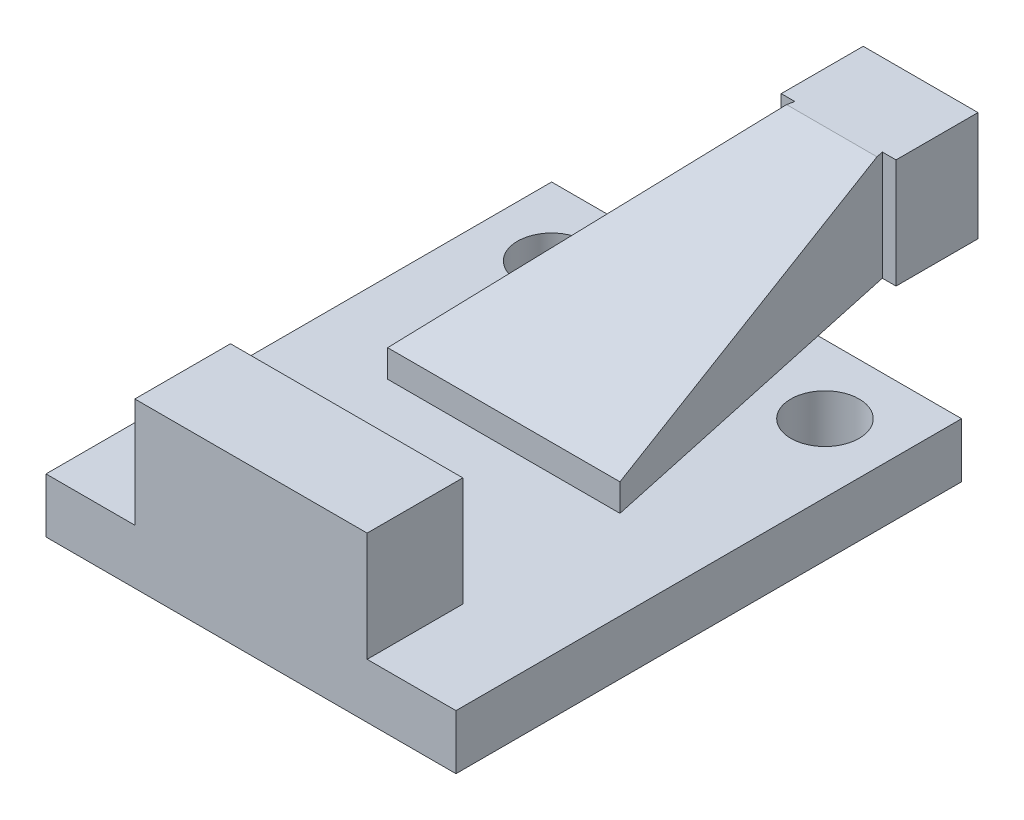
ISO-10303-21;
HEADER;
FILE_DESCRIPTION(('STEP AP214'),'2;1');
FILE_NAME('part.step','',(''),(''),'','','');
FILE_SCHEMA(('AUTOMOTIVE_DESIGN { 1 0 10303 214 1 1 1 1 }'));
ENDSEC;
DATA;
#1=APPLICATION_CONTEXT('core data for automotive mechanical design processes');
#2=APPLICATION_PROTOCOL_DEFINITION('international standard','automotive_design',2000,#1);
#3=PRODUCT_CONTEXT('',#1,'mechanical');
#4=PRODUCT('Part','Part','',(#3));
#5=PRODUCT_RELATED_PRODUCT_CATEGORY('part','',(#4));
#6=PRODUCT_DEFINITION_FORMATION('','',#4);
#7=PRODUCT_DEFINITION_CONTEXT('part definition',#1,'design');
#8=PRODUCT_DEFINITION('design','',#6,#7);
#9=PRODUCT_DEFINITION_SHAPE('','',#8);
#10=(LENGTH_UNIT() NAMED_UNIT(*) SI_UNIT(.MILLI.,.METRE.));
#11=(NAMED_UNIT(*) PLANE_ANGLE_UNIT() SI_UNIT($,.RADIAN.));
#12=(NAMED_UNIT(*) SI_UNIT($,.STERADIAN.) SOLID_ANGLE_UNIT());
#13=UNCERTAINTY_MEASURE_WITH_UNIT(LENGTH_MEASURE(1.E-05),#10,'distance_accuracy_value','');
#14=(GEOMETRIC_REPRESENTATION_CONTEXT(3) GLOBAL_UNCERTAINTY_ASSIGNED_CONTEXT((#13)) GLOBAL_UNIT_ASSIGNED_CONTEXT((#10,
#11,#12)) REPRESENTATION_CONTEXT('',''));
#15=CARTESIAN_POINT('',(0.,0.,0.));
#16=DIRECTION('',(0.,0.,1.));
#17=DIRECTION('',(1.,0.,0.));
#18=AXIS2_PLACEMENT_3D('',#15,#16,#17);
#19=CARTESIAN_POINT('',(0.,2.,0.));
#20=DIRECTION('',(0.,1.,0.));
#21=DIRECTION('',(0.,0.,1.));
#22=AXIS2_PLACEMENT_3D('',#19,#20,#21);
#23=PLANE('',#22);
#24=CARTESIAN_POINT('',(2.5,2.,-16.));
#25=DIRECTION('',(0.,1.,0.));
#26=DIRECTION('',(0.,0.,1.));
#27=AXIS2_PLACEMENT_3D('',#24,#25,#26);
#28=CIRCLE('',#27,1.25);
#29=CARTESIAN_POINT('',(2.5,2.,-14.75));
#30=VERTEX_POINT('',#29);
#31=EDGE_CURVE('E294',#30,#30,#28,.T.);
#32=ORIENTED_EDGE('',*,*,#31,.F.);
#33=EDGE_LOOP('',(#32));
#34=FACE_BOUND('',#33,.T.);
#35=CARTESIAN_POINT('',(12.5,2.,-16.));
#36=DIRECTION('',(0.,1.,0.));
#37=DIRECTION('',(0.,0.,-1.));
#38=AXIS2_PLACEMENT_3D('',#35,#36,#37);
#39=CIRCLE('',#38,1.25);
#40=CARTESIAN_POINT('',(12.5,2.,-17.25));
#41=VERTEX_POINT('',#40);
#42=EDGE_CURVE('E286',#41,#41,#39,.T.);
#43=ORIENTED_EDGE('',*,*,#42,.F.);
#44=EDGE_LOOP('',(#43));
#45=FACE_BOUND('',#44,.T.);
#46=DIRECTION('',(-1.,0.,0.));
#47=VECTOR('',#46,1.);
#48=CARTESIAN_POINT('',(0.,2.,-18.5));
#49=LINE('',#48,#47);
#50=CARTESIAN_POINT('',(15.,2.,-18.5));
#51=VERTEX_POINT('',#50);
#52=CARTESIAN_POINT('',(9.74897959183673,2.,-18.5));
#53=VERTEX_POINT('',#52);
#54=EDGE_CURVE('E315',#51,#53,#49,.T.);
#55=ORIENTED_EDGE('',*,*,#54,.T.);
#56=DIRECTION('',(-0.211435796323971,0.,-0.977391888667411));
#57=VECTOR('',#56,1.);
#58=CARTESIAN_POINT('',(11.75,2.,-9.25));
#59=LINE('',#58,#57);
#60=CARTESIAN_POINT('',(11.75,2.,-9.25));
#61=VERTEX_POINT('',#60);
#62=EDGE_CURVE('E219',#61,#53,#59,.T.);
#63=ORIENTED_EDGE('',*,*,#62,.F.);
#64=DIRECTION('',(1.,0.,0.));
#65=VECTOR('',#64,1.);
#66=CARTESIAN_POINT('',(3.25,2.,-9.25));
#67=LINE('',#66,#65);
#68=CARTESIAN_POINT('',(3.25,2.,-9.25));
#69=VERTEX_POINT('',#68);
#70=EDGE_CURVE('E203',#69,#61,#67,.T.);
#71=ORIENTED_EDGE('',*,*,#70,.F.);
#72=DIRECTION('',(-0.211435796323971,0.,0.977391888667411));
#73=VECTOR('',#72,1.);
#74=CARTESIAN_POINT('',(5.9,2.,-21.5));
#75=LINE('',#74,#73);
#76=CARTESIAN_POINT('',(5.25102040816326,2.,-18.5));
#77=VERTEX_POINT('',#76);
#78=EDGE_CURVE('E200',#77,#69,#75,.T.);
#79=ORIENTED_EDGE('',*,*,#78,.F.);
#80=CARTESIAN_POINT('',(0.,2.,-18.5));
#81=VERTEX_POINT('',#80);
#82=EDGE_CURVE('E314',#77,#81,#49,.T.);
#83=ORIENTED_EDGE('',*,*,#82,.T.);
#84=DIRECTION('',(0.,0.,1.));
#85=VECTOR('',#84,1.);
#86=CARTESIAN_POINT('',(0.,2.,-18.5));
#87=LINE('',#86,#85);
#88=CARTESIAN_POINT('',(0.,2.,0.));
#89=VERTEX_POINT('',#88);
#90=EDGE_CURVE('E302',#81,#89,#87,.T.);
#91=ORIENTED_EDGE('',*,*,#90,.T.);
#92=DIRECTION('',(1.,0.,0.));
#93=VECTOR('',#92,1.);
#94=CARTESIAN_POINT('',(0.,2.,0.));
#95=LINE('',#94,#93);
#96=CARTESIAN_POINT('',(3.25,2.,0.));
#97=VERTEX_POINT('',#96);
#98=EDGE_CURVE('E308',#89,#97,#95,.T.);
#99=ORIENTED_EDGE('',*,*,#98,.T.);
#100=DIRECTION('',(0.,0.,1.));
#101=VECTOR('',#100,1.);
#102=CARTESIAN_POINT('',(3.25,2.,-3.5));
#103=LINE('',#102,#101);
#104=CARTESIAN_POINT('',(3.25,2.,-3.5));
#105=VERTEX_POINT('',#104);
#106=EDGE_CURVE('E223',#105,#97,#103,.T.);
#107=ORIENTED_EDGE('',*,*,#106,.F.);
#108=DIRECTION('',(-1.,0.,0.));
#109=VECTOR('',#108,1.);
#110=CARTESIAN_POINT('',(3.25,2.,-3.5));
#111=LINE('',#110,#109);
#112=CARTESIAN_POINT('',(11.75,2.,-3.5));
#113=VERTEX_POINT('',#112);
#114=EDGE_CURVE('E250',#113,#105,#111,.T.);
#115=ORIENTED_EDGE('',*,*,#114,.F.);
#116=DIRECTION('',(0.,0.,-1.));
#117=VECTOR('',#116,1.);
#118=CARTESIAN_POINT('',(11.75,2.,-3.5));
#119=LINE('',#118,#117);
#120=CARTESIAN_POINT('',(11.75,2.,0.));
#121=VERTEX_POINT('',#120);
#122=EDGE_CURVE('E263',#121,#113,#119,.T.);
#123=ORIENTED_EDGE('',*,*,#122,.F.);
#124=CARTESIAN_POINT('',(15.,2.,0.));
#125=VERTEX_POINT('',#124);
#126=EDGE_CURVE('E306',#121,#125,#95,.T.);
#127=ORIENTED_EDGE('',*,*,#126,.T.);
#128=DIRECTION('',(0.,0.,-1.));
#129=VECTOR('',#128,1.);
#130=CARTESIAN_POINT('',(15.,2.,-18.5));
#131=LINE('',#130,#129);
#132=EDGE_CURVE('E311',#125,#51,#131,.T.);
#133=ORIENTED_EDGE('',*,*,#132,.T.);
#134=EDGE_LOOP('',(#55,#63,#71,#79,#83,#91,#99,#107,#115,#123,#127,#133));
#135=FACE_BOUND('',#134,.T.);
#136=ADVANCED_FACE('F45',(#34,#45,#135),#23,.T.);
#137=CARTESIAN_POINT('',(0.,0.,0.));
#138=DIRECTION('',(0.,1.,0.));
#139=DIRECTION('',(0.,0.,1.));
#140=AXIS2_PLACEMENT_3D('',#137,#138,#139);
#141=PLANE('',#140);
#142=DIRECTION('',(0.,0.,1.));
#143=VECTOR('',#142,1.);
#144=CARTESIAN_POINT('',(0.,0.,-18.5));
#145=LINE('',#144,#143);
#146=CARTESIAN_POINT('',(0.,0.,-18.5));
#147=VERTEX_POINT('',#146);
#148=CARTESIAN_POINT('',(0.,0.,0.));
#149=VERTEX_POINT('',#148);
#150=EDGE_CURVE('E298',#147,#149,#145,.T.);
#151=ORIENTED_EDGE('',*,*,#150,.F.);
#152=DIRECTION('',(-1.,0.,0.));
#153=VECTOR('',#152,1.);
#154=CARTESIAN_POINT('',(0.,0.,-18.5));
#155=LINE('',#154,#153);
#156=CARTESIAN_POINT('',(15.,0.,-18.5));
#157=VERTEX_POINT('',#156);
#158=EDGE_CURVE('E307',#157,#147,#155,.T.);
#159=ORIENTED_EDGE('',*,*,#158,.F.);
#160=DIRECTION('',(0.,0.,-1.));
#161=VECTOR('',#160,1.);
#162=CARTESIAN_POINT('',(15.,0.,-18.5));
#163=LINE('',#162,#161);
#164=CARTESIAN_POINT('',(15.,0.,0.));
#165=VERTEX_POINT('',#164);
#166=EDGE_CURVE('E326',#165,#157,#163,.T.);
#167=ORIENTED_EDGE('',*,*,#166,.F.);
#168=DIRECTION('',(1.,0.,0.));
#169=VECTOR('',#168,1.);
#170=CARTESIAN_POINT('',(0.,0.,0.));
#171=LINE('',#170,#169);
#172=EDGE_CURVE('E323',#149,#165,#171,.T.);
#173=ORIENTED_EDGE('',*,*,#172,.F.);
#174=EDGE_LOOP('',(#151,#159,#167,#173));
#175=FACE_BOUND('',#174,.T.);
#176=CARTESIAN_POINT('',(2.5,0.,-16.));
#177=DIRECTION('',(0.,1.,0.));
#178=DIRECTION('',(0.,0.,1.));
#179=AXIS2_PLACEMENT_3D('',#176,#177,#178);
#180=CIRCLE('',#179,1.25);
#181=CARTESIAN_POINT('',(2.5,0.,-14.75));
#182=VERTEX_POINT('',#181);
#183=EDGE_CURVE('E290',#182,#182,#180,.T.);
#184=ORIENTED_EDGE('',*,*,#183,.T.);
#185=EDGE_LOOP('',(#184));
#186=FACE_BOUND('',#185,.T.);
#187=CARTESIAN_POINT('',(12.5,0.,-16.));
#188=DIRECTION('',(0.,1.,0.));
#189=DIRECTION('',(0.,0.,-1.));
#190=AXIS2_PLACEMENT_3D('',#187,#188,#189);
#191=CIRCLE('',#190,1.25);
#192=CARTESIAN_POINT('',(12.5,0.,-17.25));
#193=VERTEX_POINT('',#192);
#194=EDGE_CURVE('E285',#193,#193,#191,.T.);
#195=ORIENTED_EDGE('',*,*,#194,.T.);
#196=EDGE_LOOP('',(#195));
#197=FACE_BOUND('',#196,.T.);
#198=ADVANCED_FACE('F419',(#175,#186,#197),#141,.F.);
#199=CARTESIAN_POINT('',(0.,2.,-18.5));
#200=DIRECTION('',(1.,0.,0.));
#201=DIRECTION('',(0.,0.,-1.));
#202=AXIS2_PLACEMENT_3D('',#199,#200,#201);
#203=PLANE('',#202);
#204=ORIENTED_EDGE('',*,*,#150,.T.);
#205=DIRECTION('',(0.,-1.,0.));
#206=VECTOR('',#205,1.);
#207=CARTESIAN_POINT('',(0.,2.,0.));
#208=LINE('',#207,#206);
#209=EDGE_CURVE('E342',#89,#149,#208,.T.);
#210=ORIENTED_EDGE('',*,*,#209,.F.);
#211=ORIENTED_EDGE('',*,*,#90,.F.);
#212=DIRECTION('',(0.,-1.,0.));
#213=VECTOR('',#212,1.);
#214=CARTESIAN_POINT('',(0.,2.,-18.5));
#215=LINE('',#214,#213);
#216=EDGE_CURVE('E319',#81,#147,#215,.T.);
#217=ORIENTED_EDGE('',*,*,#216,.T.);
#218=EDGE_LOOP('',(#204,#210,#211,#217));
#219=FACE_BOUND('',#218,.T.);
#220=ADVANCED_FACE('F425',(#219),#203,.F.);
#221=CARTESIAN_POINT('',(0.,2.,0.));
#222=DIRECTION('',(0.,0.,-1.));
#223=DIRECTION('',(-1.,0.,0.));
#224=AXIS2_PLACEMENT_3D('',#221,#222,#223);
#225=PLANE('',#224);
#226=ORIENTED_EDGE('',*,*,#172,.T.);
#227=DIRECTION('',(0.,-1.,0.));
#228=VECTOR('',#227,1.);
#229=CARTESIAN_POINT('',(15.,2.,0.));
#230=LINE('',#229,#228);
#231=EDGE_CURVE('E338',#125,#165,#230,.T.);
#232=ORIENTED_EDGE('',*,*,#231,.F.);
#233=ORIENTED_EDGE('',*,*,#126,.F.);
#234=DIRECTION('',(0.,-1.,0.));
#235=VECTOR('',#234,1.);
#236=CARTESIAN_POINT('',(11.75,6.,0.));
#237=LINE('',#236,#235);
#238=CARTESIAN_POINT('',(11.75,6.,0.));
#239=VERTEX_POINT('',#238);
#240=EDGE_CURVE('E277',#239,#121,#237,.T.);
#241=ORIENTED_EDGE('',*,*,#240,.F.);
#242=DIRECTION('',(1.,0.,0.));
#243=VECTOR('',#242,1.);
#244=CARTESIAN_POINT('',(3.25,6.,0.));
#245=LINE('',#244,#243);
#246=CARTESIAN_POINT('',(3.25,6.,0.));
#247=VERTEX_POINT('',#246);
#248=EDGE_CURVE('E249',#247,#239,#245,.T.);
#249=ORIENTED_EDGE('',*,*,#248,.F.);
#250=DIRECTION('',(0.,-1.,0.));
#251=VECTOR('',#250,1.);
#252=CARTESIAN_POINT('',(3.25,6.,0.));
#253=LINE('',#252,#251);
#254=EDGE_CURVE('E281',#247,#97,#253,.T.);
#255=ORIENTED_EDGE('',*,*,#254,.T.);
#256=ORIENTED_EDGE('',*,*,#98,.F.);
#257=ORIENTED_EDGE('',*,*,#209,.T.);
#258=EDGE_LOOP('',(#226,#232,#233,#241,#249,#255,#256,#257));
#259=FACE_BOUND('',#258,.T.);
#260=ADVANCED_FACE('F441',(#259),#225,.F.);
#261=CARTESIAN_POINT('',(15.,2.,-18.5));
#262=DIRECTION('',(-1.,0.,0.));
#263=DIRECTION('',(0.,0.,1.));
#264=AXIS2_PLACEMENT_3D('',#261,#262,#263);
#265=PLANE('',#264);
#266=ORIENTED_EDGE('',*,*,#166,.T.);
#267=DIRECTION('',(0.,-1.,0.));
#268=VECTOR('',#267,1.);
#269=CARTESIAN_POINT('',(15.,2.,-18.5));
#270=LINE('',#269,#268);
#271=EDGE_CURVE('E334',#51,#157,#270,.T.);
#272=ORIENTED_EDGE('',*,*,#271,.F.);
#273=ORIENTED_EDGE('',*,*,#132,.F.);
#274=ORIENTED_EDGE('',*,*,#231,.T.);
#275=EDGE_LOOP('',(#266,#272,#273,#274));
#276=FACE_BOUND('',#275,.T.);
#277=ADVANCED_FACE('F437',(#276),#265,.F.);
#278=CARTESIAN_POINT('',(0.,2.,-18.5));
#279=DIRECTION('',(0.,0.,1.));
#280=DIRECTION('',(1.,0.,0.));
#281=AXIS2_PLACEMENT_3D('',#278,#279,#280);
#282=PLANE('',#281);
#283=ORIENTED_EDGE('',*,*,#158,.T.);
#284=ORIENTED_EDGE('',*,*,#216,.F.);
#285=ORIENTED_EDGE('',*,*,#82,.F.);
#286=EDGE_CURVE('E198',#53,#77,#49,.T.);
#287=ORIENTED_EDGE('',*,*,#286,.F.);
#288=ORIENTED_EDGE('',*,*,#54,.F.);
#289=ORIENTED_EDGE('',*,*,#271,.T.);
#290=EDGE_LOOP('',(#283,#284,#285,#287,#288,#289));
#291=FACE_BOUND('',#290,.T.);
#292=ADVANCED_FACE('F434',(#291),#282,.F.);
#293=CARTESIAN_POINT('',(2.5,2.,-16.));
#294=DIRECTION('',(0.,-1.,0.));
#295=DIRECTION('',(0.,0.,-1.));
#296=AXIS2_PLACEMENT_3D('',#293,#294,#295);
#297=CYLINDRICAL_SURFACE('',#296,1.25);
#298=ORIENTED_EDGE('',*,*,#31,.T.);
#299=EDGE_LOOP('',(#298));
#300=FACE_BOUND('',#299,.T.);
#301=ORIENTED_EDGE('',*,*,#183,.F.);
#302=EDGE_LOOP('',(#301));
#303=FACE_BOUND('',#302,.T.);
#304=ADVANCED_FACE('F431',(#300,#303),#297,.F.);
#305=CARTESIAN_POINT('',(12.5,2.,-16.));
#306=DIRECTION('',(0.,-1.,0.));
#307=DIRECTION('',(0.,0.,-1.));
#308=AXIS2_PLACEMENT_3D('',#305,#306,#307);
#309=CYLINDRICAL_SURFACE('',#308,1.25);
#310=ORIENTED_EDGE('',*,*,#42,.T.);
#311=EDGE_LOOP('',(#310));
#312=FACE_BOUND('',#311,.T.);
#313=ORIENTED_EDGE('',*,*,#194,.F.);
#314=EDGE_LOOP('',(#313));
#315=FACE_BOUND('',#314,.T.);
#316=ADVANCED_FACE('F486',(#312,#315),#309,.F.);
#317=CARTESIAN_POINT('',(3.25,6.,-3.5));
#318=DIRECTION('',(1.,0.,0.));
#319=DIRECTION('',(0.,0.,-1.));
#320=AXIS2_PLACEMENT_3D('',#317,#318,#319);
#321=PLANE('',#320);
#322=ORIENTED_EDGE('',*,*,#106,.T.);
#323=ORIENTED_EDGE('',*,*,#254,.F.);
#324=DIRECTION('',(0.,0.,1.));
#325=VECTOR('',#324,1.);
#326=CARTESIAN_POINT('',(3.25,6.,-3.5));
#327=LINE('',#326,#325);
#328=CARTESIAN_POINT('',(3.25,6.,-3.5));
#329=VERTEX_POINT('',#328);
#330=EDGE_CURVE('E245',#329,#247,#327,.T.);
#331=ORIENTED_EDGE('',*,*,#330,.F.);
#332=DIRECTION('',(0.,-1.,0.));
#333=VECTOR('',#332,1.);
#334=CARTESIAN_POINT('',(3.25,6.,-3.5));
#335=LINE('',#334,#333);
#336=EDGE_CURVE('E259',#329,#105,#335,.T.);
#337=ORIENTED_EDGE('',*,*,#336,.T.);
#338=EDGE_LOOP('',(#322,#323,#331,#337));
#339=FACE_BOUND('',#338,.T.);
#340=ADVANCED_FACE('F472',(#339),#321,.F.);
#341=CARTESIAN_POINT('',(11.75,6.,-3.5));
#342=DIRECTION('',(-1.,0.,0.));
#343=DIRECTION('',(0.,0.,1.));
#344=AXIS2_PLACEMENT_3D('',#341,#342,#343);
#345=PLANE('',#344);
#346=ORIENTED_EDGE('',*,*,#122,.T.);
#347=DIRECTION('',(0.,-1.,0.));
#348=VECTOR('',#347,1.);
#349=CARTESIAN_POINT('',(11.75,6.,-3.5));
#350=LINE('',#349,#348);
#351=CARTESIAN_POINT('',(11.75,6.,-3.5));
#352=VERTEX_POINT('',#351);
#353=EDGE_CURVE('E273',#352,#113,#350,.T.);
#354=ORIENTED_EDGE('',*,*,#353,.F.);
#355=DIRECTION('',(0.,0.,-1.));
#356=VECTOR('',#355,1.);
#357=CARTESIAN_POINT('',(11.75,6.,-3.5));
#358=LINE('',#357,#356);
#359=EDGE_CURVE('E253',#239,#352,#358,.T.);
#360=ORIENTED_EDGE('',*,*,#359,.F.);
#361=ORIENTED_EDGE('',*,*,#240,.T.);
#362=EDGE_LOOP('',(#346,#354,#360,#361));
#363=FACE_BOUND('',#362,.T.);
#364=ADVANCED_FACE('F464',(#363),#345,.F.);
#365=CARTESIAN_POINT('',(3.25,6.,-3.5));
#366=DIRECTION('',(0.,0.,1.));
#367=DIRECTION('',(1.,0.,0.));
#368=AXIS2_PLACEMENT_3D('',#365,#366,#367);
#369=PLANE('',#368);
#370=ORIENTED_EDGE('',*,*,#114,.T.);
#371=ORIENTED_EDGE('',*,*,#336,.F.);
#372=DIRECTION('',(-1.,0.,0.));
#373=VECTOR('',#372,1.);
#374=CARTESIAN_POINT('',(3.25,6.,-3.5));
#375=LINE('',#374,#373);
#376=EDGE_CURVE('E256',#352,#329,#375,.T.);
#377=ORIENTED_EDGE('',*,*,#376,.F.);
#378=ORIENTED_EDGE('',*,*,#353,.T.);
#379=EDGE_LOOP('',(#370,#371,#377,#378));
#380=FACE_BOUND('',#379,.T.);
#381=ADVANCED_FACE('F474',(#380),#369,.F.);
#382=CARTESIAN_POINT('',(0.,6.,0.));
#383=DIRECTION('',(0.,1.,0.));
#384=DIRECTION('',(0.,0.,1.));
#385=AXIS2_PLACEMENT_3D('',#382,#383,#384);
#386=PLANE('',#385);
#387=ORIENTED_EDGE('',*,*,#330,.T.);
#388=ORIENTED_EDGE('',*,*,#248,.T.);
#389=ORIENTED_EDGE('',*,*,#359,.T.);
#390=ORIENTED_EDGE('',*,*,#376,.T.);
#391=EDGE_LOOP('',(#387,#388,#389,#390));
#392=FACE_BOUND('',#391,.T.);
#393=ADVANCED_FACE('F468',(#392),#386,.T.);
#394=CARTESIAN_POINT('',(0.,2.,0.));
#395=DIRECTION('',(0.,-1.,0.));
#396=DIRECTION('',(0.,0.,-1.));
#397=AXIS2_PLACEMENT_3D('',#394,#395,#396);
#398=PLANE('',#397);
#399=ORIENTED_EDGE('',*,*,#286,.T.);
#400=CARTESIAN_POINT('',(5.9,2.,-21.5));
#401=VERTEX_POINT('',#400);
#402=EDGE_CURVE('E184',#401,#77,#75,.T.);
#403=ORIENTED_EDGE('',*,*,#402,.F.);
#404=DIRECTION('',(1.,0.,0.));
#405=VECTOR('',#404,1.);
#406=CARTESIAN_POINT('',(5.4,2.,-21.5));
#407=LINE('',#406,#405);
#408=CARTESIAN_POINT('',(5.4,2.,-21.5));
#409=VERTEX_POINT('',#408);
#410=EDGE_CURVE('E171',#409,#401,#407,.T.);
#411=ORIENTED_EDGE('',*,*,#410,.F.);
#412=DIRECTION('',(0.,0.,1.));
#413=VECTOR('',#412,1.);
#414=CARTESIAN_POINT('',(5.4,2.,-24.5));
#415=LINE('',#414,#413);
#416=CARTESIAN_POINT('',(5.4,2.,-24.5));
#417=VERTEX_POINT('',#416);
#418=EDGE_CURVE('E183',#417,#409,#415,.T.);
#419=ORIENTED_EDGE('',*,*,#418,.F.);
#420=DIRECTION('',(-1.,0.,0.));
#421=VECTOR('',#420,1.);
#422=CARTESIAN_POINT('',(5.4,2.,-24.5));
#423=LINE('',#422,#421);
#424=CARTESIAN_POINT('',(9.6,2.,-24.5));
#425=VERTEX_POINT('',#424);
#426=EDGE_CURVE('E209',#425,#417,#423,.T.);
#427=ORIENTED_EDGE('',*,*,#426,.F.);
#428=DIRECTION('',(0.,0.,-1.));
#429=VECTOR('',#428,1.);
#430=CARTESIAN_POINT('',(9.6,2.,-24.5));
#431=LINE('',#430,#429);
#432=CARTESIAN_POINT('',(9.6,2.,-21.5));
#433=VERTEX_POINT('',#432);
#434=EDGE_CURVE('E212',#433,#425,#431,.T.);
#435=ORIENTED_EDGE('',*,*,#434,.F.);
#436=DIRECTION('',(1.,0.,0.));
#437=VECTOR('',#436,1.);
#438=CARTESIAN_POINT('',(9.1,2.,-21.5));
#439=LINE('',#438,#437);
#440=CARTESIAN_POINT('',(9.1,2.,-21.5));
#441=VERTEX_POINT('',#440);
#442=EDGE_CURVE('E215',#441,#433,#439,.T.);
#443=ORIENTED_EDGE('',*,*,#442,.F.);
#444=EDGE_CURVE('E218',#53,#441,#59,.T.);
#445=ORIENTED_EDGE('',*,*,#444,.F.);
#446=EDGE_LOOP('',(#399,#403,#411,#419,#427,#435,#443,#445));
#447=FACE_BOUND('',#446,.T.);
#448=ADVANCED_FACE('F196',(#447),#398,.T.);
#449=CARTESIAN_POINT('',(11.75,6.,-9.25));
#450=DIRECTION('',(-0.977391888667411,0.,0.211435796323971));
#451=DIRECTION('',(0.211435796323971,0.,0.977391888667411));
#452=AXIS2_PLACEMENT_3D('',#449,#450,#451);
#453=PLANE('',#452);
#454=DIRECTION('',(-0.211435796323971,0.,-0.977391888667411));
#455=VECTOR('',#454,1.);
#456=CARTESIAN_POINT('',(11.75,6.,-9.25));
#457=LINE('',#456,#455);
#458=CARTESIAN_POINT('',(9.15408163265302,6.,-21.2500000000002));
#459=VERTEX_POINT('',#458);
#460=CARTESIAN_POINT('',(9.1,6.,-21.5));
#461=VERTEX_POINT('',#460);
#462=EDGE_CURVE('E242',#459,#461,#457,.T.);
#463=ORIENTED_EDGE('',*,*,#462,.F.);
#464=DIRECTION('',(-0.205393092137298,0.237364658366213,-0.949458633464866));
#465=VECTOR('',#464,1.);
#466=CARTESIAN_POINT('',(8.76790459455828,6.44628950157175,-23.0351580062872));
#467=LINE('',#466,#465);
#468=CARTESIAN_POINT('',(11.75,3.,-9.25));
#469=VERTEX_POINT('',#468);
#470=EDGE_CURVE('E69',#459,#469,#467,.F.);
#471=ORIENTED_EDGE('',*,*,#470,.T.);
#472=DIRECTION('',(0.,-1.,0.));
#473=VECTOR('',#472,1.);
#474=CARTESIAN_POINT('',(11.75,6.,-9.25));
#475=LINE('',#474,#473);
#476=EDGE_CURVE('E227',#469,#61,#475,.T.);
#477=ORIENTED_EDGE('',*,*,#476,.T.);
#478=ORIENTED_EDGE('',*,*,#62,.T.);
#479=ORIENTED_EDGE('',*,*,#444,.T.);
#480=DIRECTION('',(0.,-1.,0.));
#481=VECTOR('',#480,1.);
#482=CARTESIAN_POINT('',(9.1,6.,-21.5));
#483=LINE('',#482,#481);
#484=EDGE_CURVE('E360',#461,#441,#483,.T.);
#485=ORIENTED_EDGE('',*,*,#484,.F.);
#486=EDGE_LOOP('',(#463,#471,#477,#478,#479,#485));
#487=FACE_BOUND('',#486,.T.);
#488=ADVANCED_FACE('F358',(#487),#453,.F.);
#489=CARTESIAN_POINT('',(9.1,6.,-21.5));
#490=DIRECTION('',(0.,0.,-1.));
#491=DIRECTION('',(-1.,0.,0.));
#492=AXIS2_PLACEMENT_3D('',#489,#490,#491);
#493=PLANE('',#492);
#494=ORIENTED_EDGE('',*,*,#442,.T.);
#495=DIRECTION('',(0.,-1.,0.));
#496=VECTOR('',#495,1.);
#497=CARTESIAN_POINT('',(9.6,6.,-21.5));
#498=LINE('',#497,#496);
#499=CARTESIAN_POINT('',(9.6,6.,-21.5));
#500=VERTEX_POINT('',#499);
#501=EDGE_CURVE('E370',#500,#433,#498,.T.);
#502=ORIENTED_EDGE('',*,*,#501,.F.);
#503=DIRECTION('',(1.,0.,0.));
#504=VECTOR('',#503,1.);
#505=CARTESIAN_POINT('',(9.1,6.,-21.5));
#506=LINE('',#505,#504);
#507=EDGE_CURVE('E239',#461,#500,#506,.T.);
#508=ORIENTED_EDGE('',*,*,#507,.F.);
#509=ORIENTED_EDGE('',*,*,#484,.T.);
#510=EDGE_LOOP('',(#494,#502,#508,#509));
#511=FACE_BOUND('',#510,.T.);
#512=ADVANCED_FACE('F368',(#511),#493,.F.);
#513=CARTESIAN_POINT('',(9.6,6.,-24.5));
#514=DIRECTION('',(-1.,0.,0.));
#515=DIRECTION('',(0.,0.,1.));
#516=AXIS2_PLACEMENT_3D('',#513,#514,#515);
#517=PLANE('',#516);
#518=ORIENTED_EDGE('',*,*,#434,.T.);
#519=DIRECTION('',(0.,-1.,0.));
#520=VECTOR('',#519,1.);
#521=CARTESIAN_POINT('',(9.6,6.,-24.5));
#522=LINE('',#521,#520);
#523=CARTESIAN_POINT('',(9.6,6.,-24.5));
#524=VERTEX_POINT('',#523);
#525=EDGE_CURVE('E373',#524,#425,#522,.T.);
#526=ORIENTED_EDGE('',*,*,#525,.F.);
#527=DIRECTION('',(0.,0.,-1.));
#528=VECTOR('',#527,1.);
#529=CARTESIAN_POINT('',(9.6,6.,-24.5));
#530=LINE('',#529,#528);
#531=EDGE_CURVE('E236',#500,#524,#530,.T.);
#532=ORIENTED_EDGE('',*,*,#531,.F.);
#533=ORIENTED_EDGE('',*,*,#501,.T.);
#534=EDGE_LOOP('',(#518,#526,#532,#533));
#535=FACE_BOUND('',#534,.T.);
#536=ADVANCED_FACE('F409',(#535),#517,.F.);
#537=CARTESIAN_POINT('',(5.4,6.,-24.5));
#538=DIRECTION('',(0.,0.,1.));
#539=DIRECTION('',(1.,0.,0.));
#540=AXIS2_PLACEMENT_3D('',#537,#538,#539);
#541=PLANE('',#540);
#542=ORIENTED_EDGE('',*,*,#426,.T.);
#543=DIRECTION('',(0.,-1.,0.));
#544=VECTOR('',#543,1.);
#545=CARTESIAN_POINT('',(5.4,6.,-24.5));
#546=LINE('',#545,#544);
#547=CARTESIAN_POINT('',(5.4,6.,-24.5));
#548=VERTEX_POINT('',#547);
#549=EDGE_CURVE('E379',#548,#417,#546,.T.);
#550=ORIENTED_EDGE('',*,*,#549,.F.);
#551=DIRECTION('',(-1.,0.,0.));
#552=VECTOR('',#551,1.);
#553=CARTESIAN_POINT('',(5.4,6.,-24.5));
#554=LINE('',#553,#552);
#555=EDGE_CURVE('E233',#524,#548,#554,.T.);
#556=ORIENTED_EDGE('',*,*,#555,.F.);
#557=ORIENTED_EDGE('',*,*,#525,.T.);
#558=EDGE_LOOP('',(#542,#550,#556,#557));
#559=FACE_BOUND('',#558,.T.);
#560=ADVANCED_FACE('F405',(#559),#541,.F.);
#561=CARTESIAN_POINT('',(5.4,6.,-24.5));
#562=DIRECTION('',(1.,0.,0.));
#563=DIRECTION('',(0.,0.,-1.));
#564=AXIS2_PLACEMENT_3D('',#561,#562,#563);
#565=PLANE('',#564);
#566=ORIENTED_EDGE('',*,*,#418,.T.);
#567=DIRECTION('',(0.,-1.,0.));
#568=VECTOR('',#567,1.);
#569=CARTESIAN_POINT('',(5.4,6.,-21.5));
#570=LINE('',#569,#568);
#571=CARTESIAN_POINT('',(5.4,6.,-21.5));
#572=VERTEX_POINT('',#571);
#573=EDGE_CURVE('E178',#572,#409,#570,.T.);
#574=ORIENTED_EDGE('',*,*,#573,.F.);
#575=DIRECTION('',(0.,0.,1.));
#576=VECTOR('',#575,1.);
#577=CARTESIAN_POINT('',(5.4,6.,-24.5));
#578=LINE('',#577,#576);
#579=EDGE_CURVE('E230',#548,#572,#578,.T.);
#580=ORIENTED_EDGE('',*,*,#579,.F.);
#581=ORIENTED_EDGE('',*,*,#549,.T.);
#582=EDGE_LOOP('',(#566,#574,#580,#581));
#583=FACE_BOUND('',#582,.T.);
#584=ADVANCED_FACE('F403',(#583),#565,.F.);
#585=CARTESIAN_POINT('',(5.4,6.,-21.5));
#586=DIRECTION('',(0.,0.,-1.));
#587=DIRECTION('',(-1.,0.,0.));
#588=AXIS2_PLACEMENT_3D('',#585,#586,#587);
#589=PLANE('',#588);
#590=ORIENTED_EDGE('',*,*,#410,.T.);
#591=DIRECTION('',(0.,-1.,0.));
#592=VECTOR('',#591,1.);
#593=CARTESIAN_POINT('',(5.9,6.,-21.5));
#594=LINE('',#593,#592);
#595=CARTESIAN_POINT('',(5.9,6.,-21.5));
#596=VERTEX_POINT('',#595);
#597=EDGE_CURVE('E175',#596,#401,#594,.T.);
#598=ORIENTED_EDGE('',*,*,#597,.F.);
#599=DIRECTION('',(1.,0.,0.));
#600=VECTOR('',#599,1.);
#601=CARTESIAN_POINT('',(5.4,6.,-21.5));
#602=LINE('',#601,#600);
#603=EDGE_CURVE('E226',#572,#596,#602,.T.);
#604=ORIENTED_EDGE('',*,*,#603,.F.);
#605=ORIENTED_EDGE('',*,*,#573,.T.);
#606=EDGE_LOOP('',(#590,#598,#604,#605));
#607=FACE_BOUND('',#606,.T.);
#608=ADVANCED_FACE('F173',(#607),#589,.F.);
#609=CARTESIAN_POINT('',(5.9,6.,-21.5));
#610=DIRECTION('',(0.977391888667411,0.,0.211435796323971));
#611=DIRECTION('',(0.211435796323971,0.,-0.977391888667411));
#612=AXIS2_PLACEMENT_3D('',#609,#610,#611);
#613=PLANE('',#612);
#614=DIRECTION('',(0.,-1.,0.));
#615=VECTOR('',#614,1.);
#616=CARTESIAN_POINT('',(3.25,6.,-9.25));
#617=LINE('',#616,#615);
#618=CARTESIAN_POINT('',(3.25,3.,-9.25));
#619=VERTEX_POINT('',#618);
#620=EDGE_CURVE('E193',#619,#69,#617,.T.);
#621=ORIENTED_EDGE('',*,*,#620,.F.);
#622=DIRECTION('',(-0.205393092137298,-0.237364658366213,0.949458633464866));
#623=VECTOR('',#622,1.);
#624=CARTESIAN_POINT('',(5.59930057097591,5.7149935843825,-20.1099743375302));
#625=LINE('',#624,#623);
#626=CARTESIAN_POINT('',(5.84591836734697,6.,-21.2500000000002));
#627=VERTEX_POINT('',#626);
#628=EDGE_CURVE('E11',#619,#627,#625,.F.);
#629=ORIENTED_EDGE('',*,*,#628,.T.);
#630=DIRECTION('',(-0.211435796323971,0.,0.977391888667411));
#631=VECTOR('',#630,1.);
#632=CARTESIAN_POINT('',(5.9,6.,-21.5));
#633=LINE('',#632,#631);
#634=EDGE_CURVE('E191',#596,#627,#633,.T.);
#635=ORIENTED_EDGE('',*,*,#634,.F.);
#636=ORIENTED_EDGE('',*,*,#597,.T.);
#637=ORIENTED_EDGE('',*,*,#402,.T.);
#638=ORIENTED_EDGE('',*,*,#78,.T.);
#639=EDGE_LOOP('',(#621,#629,#635,#636,#637,#638));
#640=FACE_BOUND('',#639,.T.);
#641=ADVANCED_FACE('F188',(#640),#613,.F.);
#642=CARTESIAN_POINT('',(3.25,6.,-9.25));
#643=DIRECTION('',(0.,0.,-1.));
#644=DIRECTION('',(-1.,0.,0.));
#645=AXIS2_PLACEMENT_3D('',#642,#643,#644);
#646=PLANE('',#645);
#647=ORIENTED_EDGE('',*,*,#476,.F.);
#648=DIRECTION('',(-1.,0.,0.));
#649=VECTOR('',#648,1.);
#650=CARTESIAN_POINT('',(3.25,3.,-9.25));
#651=LINE('',#650,#649);
#652=EDGE_CURVE('E55',#469,#619,#651,.T.);
#653=ORIENTED_EDGE('',*,*,#652,.T.);
#654=ORIENTED_EDGE('',*,*,#620,.T.);
#655=ORIENTED_EDGE('',*,*,#70,.T.);
#656=EDGE_LOOP('',(#647,#653,#654,#655));
#657=FACE_BOUND('',#656,.T.);
#658=ADVANCED_FACE('F392',(#657),#646,.F.);
#659=CARTESIAN_POINT('',(0.,6.,0.));
#660=DIRECTION('',(0.,-1.,0.));
#661=DIRECTION('',(0.,0.,-1.));
#662=AXIS2_PLACEMENT_3D('',#659,#660,#661);
#663=PLANE('',#662);
#664=ORIENTED_EDGE('',*,*,#634,.T.);
#665=DIRECTION('',(1.,0.,0.));
#666=VECTOR('',#665,1.);
#667=CARTESIAN_POINT('',(0.,6.,-21.2500000000002));
#668=LINE('',#667,#666);
#669=EDGE_CURVE('E346',#627,#459,#668,.T.);
#670=ORIENTED_EDGE('',*,*,#669,.T.);
#671=ORIENTED_EDGE('',*,*,#462,.T.);
#672=ORIENTED_EDGE('',*,*,#507,.T.);
#673=ORIENTED_EDGE('',*,*,#531,.T.);
#674=ORIENTED_EDGE('',*,*,#555,.T.);
#675=ORIENTED_EDGE('',*,*,#579,.T.);
#676=ORIENTED_EDGE('',*,*,#603,.T.);
#677=EDGE_LOOP('',(#664,#670,#671,#672,#673,#674,#675,#676));
#678=FACE_BOUND('',#677,.T.);
#679=ADVANCED_FACE('F398',(#678),#663,.F.);
#680=CARTESIAN_POINT('',(0.,6.,-21.2500000000002));
#681=DIRECTION('',(0.,-0.970142500145333,-0.24253562503633));
#682=DIRECTION('',(1.,0.,0.));
#683=AXIS2_PLACEMENT_3D('',#680,#681,#682);
#684=PLANE('',#683);
#685=ORIENTED_EDGE('',*,*,#628,.F.);
#686=ORIENTED_EDGE('',*,*,#652,.F.);
#687=ORIENTED_EDGE('',*,*,#470,.F.);
#688=ORIENTED_EDGE('',*,*,#669,.F.);
#689=EDGE_LOOP('',(#685,#686,#687,#688));
#690=FACE_BOUND('',#689,.T.);
#691=ADVANCED_FACE('F48',(#690),#684,.F.);
#692=CLOSED_SHELL('',(#136,#198,#220,#260,#277,#292,#304,#316,#340,#364,#381,#393,#448,#488,
#512,#536,#560,#584,#608,#641,#658,#679,#691));
#693=MANIFOLD_SOLID_BREP('B2',#692);
#694=ADVANCED_BREP_SHAPE_REPRESENTATION('',(#18,#693),#14);
#695=SHAPE_DEFINITION_REPRESENTATION(#9,#694);
ENDSEC;
END-ISO-10303-21;
